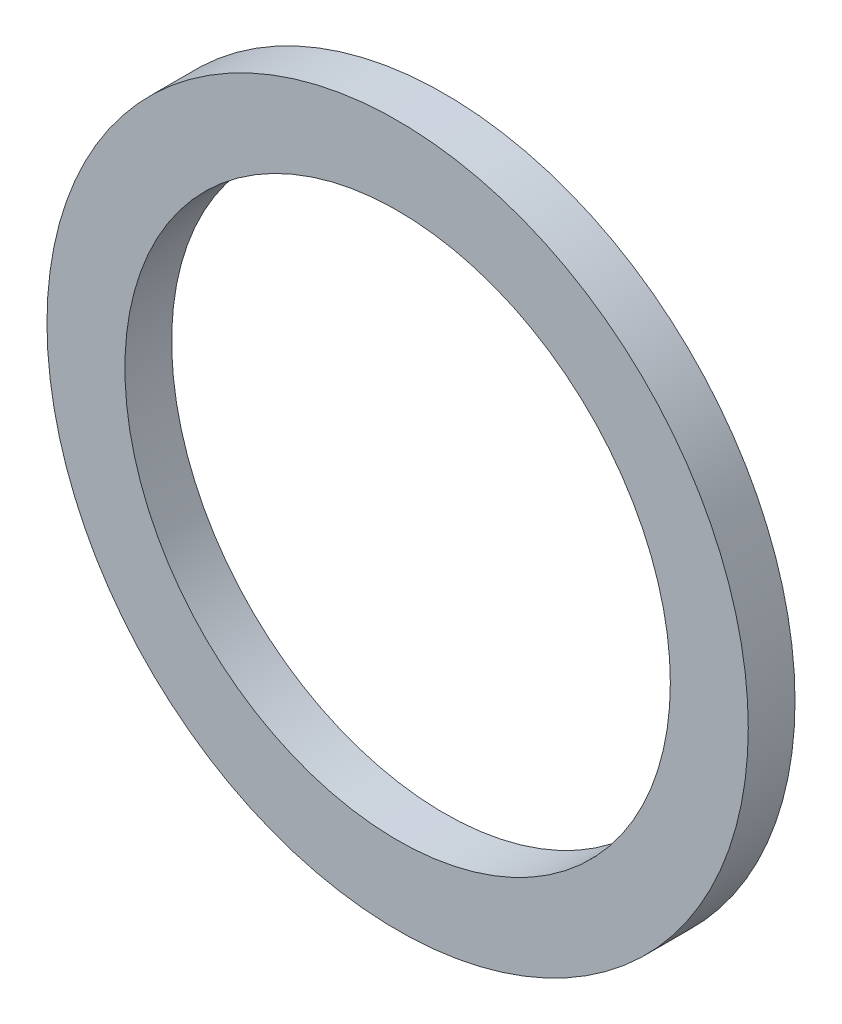
ISO-10303-21;
HEADER;
FILE_DESCRIPTION(('STEP AP214'),'2;1');
FILE_NAME('part.step','',(''),(''),'','','');
FILE_SCHEMA(('AUTOMOTIVE_DESIGN { 1 0 10303 214 1 1 1 1 }'));
ENDSEC;
DATA;
#1=APPLICATION_CONTEXT('core data for automotive mechanical design processes');
#2=APPLICATION_PROTOCOL_DEFINITION('international standard','automotive_design',2000,#1);
#3=PRODUCT_CONTEXT('',#1,'mechanical');
#4=PRODUCT('Part','Part','',(#3));
#5=PRODUCT_RELATED_PRODUCT_CATEGORY('part','',(#4));
#6=PRODUCT_DEFINITION_FORMATION('','',#4);
#7=PRODUCT_DEFINITION_CONTEXT('part definition',#1,'design');
#8=PRODUCT_DEFINITION('design','',#6,#7);
#9=PRODUCT_DEFINITION_SHAPE('','',#8);
#10=(LENGTH_UNIT() NAMED_UNIT(*) SI_UNIT(.MILLI.,.METRE.));
#11=(NAMED_UNIT(*) PLANE_ANGLE_UNIT() SI_UNIT($,.RADIAN.));
#12=(NAMED_UNIT(*) SI_UNIT($,.STERADIAN.) SOLID_ANGLE_UNIT());
#13=UNCERTAINTY_MEASURE_WITH_UNIT(LENGTH_MEASURE(1.E-05),#10,'distance_accuracy_value','');
#14=(GEOMETRIC_REPRESENTATION_CONTEXT(3) GLOBAL_UNCERTAINTY_ASSIGNED_CONTEXT((#13)) GLOBAL_UNIT_ASSIGNED_CONTEXT((#10,
#11,#12)) REPRESENTATION_CONTEXT('',''));
#15=CARTESIAN_POINT('',(0.,0.,0.));
#16=DIRECTION('',(0.,0.,1.));
#17=DIRECTION('',(1.,0.,0.));
#18=AXIS2_PLACEMENT_3D('',#15,#16,#17);
#19=CARTESIAN_POINT('',(0.,0.,2.));
#20=DIRECTION('',(0.,0.,1.));
#21=DIRECTION('',(1.,0.,0.));
#22=AXIS2_PLACEMENT_3D('',#19,#20,#21);
#23=PLANE('',#22);
#24=CARTESIAN_POINT('',(0.,0.,2.));
#25=DIRECTION('',(0.,0.,1.));
#26=DIRECTION('',(1.,0.,0.));
#27=AXIS2_PLACEMENT_3D('',#24,#25,#26);
#28=CIRCLE('',#27,22.5);
#29=CARTESIAN_POINT('',(22.5,0.,2.));
#30=VERTEX_POINT('',#29);
#31=EDGE_CURVE('E10',#30,#30,#28,.T.);
#32=ORIENTED_EDGE('',*,*,#31,.T.);
#33=EDGE_LOOP('',(#32));
#34=FACE_BOUND('',#33,.T.);
#35=CARTESIAN_POINT('',(0.,0.,2.));
#36=DIRECTION('',(0.,0.,1.));
#37=DIRECTION('',(1.,0.,0.));
#38=AXIS2_PLACEMENT_3D('',#35,#36,#37);
#39=CIRCLE('',#38,17.5);
#40=CARTESIAN_POINT('',(17.5,0.,2.));
#41=VERTEX_POINT('',#40);
#42=EDGE_CURVE('E46',#41,#41,#39,.T.);
#43=ORIENTED_EDGE('',*,*,#42,.F.);
#44=EDGE_LOOP('',(#43));
#45=FACE_BOUND('',#44,.T.);
#46=ADVANCED_FACE('F39',(#34,#45),#23,.T.);
#47=CARTESIAN_POINT('',(0.,0.,2.));
#48=DIRECTION('',(0.,0.,-1.));
#49=DIRECTION('',(-1.,0.,0.));
#50=AXIS2_PLACEMENT_3D('',#47,#48,#49);
#51=CYLINDRICAL_SURFACE('',#50,22.5);
#52=ORIENTED_EDGE('',*,*,#31,.F.);
#53=EDGE_LOOP('',(#52));
#54=FACE_BOUND('',#53,.T.);
#55=CARTESIAN_POINT('',(0.,0.,-1.));
#56=DIRECTION('',(0.,0.,-1.));
#57=DIRECTION('',(-1.,0.,0.));
#58=AXIS2_PLACEMENT_3D('',#55,#56,#57);
#59=CIRCLE('',#58,22.5);
#60=CARTESIAN_POINT('',(-22.5,0.,-1.));
#61=VERTEX_POINT('',#60);
#62=EDGE_CURVE('E50',#61,#61,#59,.T.);
#63=ORIENTED_EDGE('',*,*,#62,.F.);
#64=EDGE_LOOP('',(#63));
#65=FACE_BOUND('',#64,.T.);
#66=ADVANCED_FACE('F41',(#54,#65),#51,.T.);
#67=CARTESIAN_POINT('',(0.,0.,2.));
#68=DIRECTION('',(0.,0.,-1.));
#69=DIRECTION('',(-1.,0.,0.));
#70=AXIS2_PLACEMENT_3D('',#67,#68,#69);
#71=CYLINDRICAL_SURFACE('',#70,17.5);
#72=ORIENTED_EDGE('',*,*,#42,.T.);
#73=EDGE_LOOP('',(#72));
#74=FACE_BOUND('',#73,.T.);
#75=CARTESIAN_POINT('',(0.,0.,-1.));
#76=DIRECTION('',(0.,0.,1.));
#77=DIRECTION('',(1.,0.,0.));
#78=AXIS2_PLACEMENT_3D('',#75,#76,#77);
#79=CIRCLE('',#78,17.5);
#80=CARTESIAN_POINT('',(17.5,0.,-1.));
#81=VERTEX_POINT('',#80);
#82=EDGE_CURVE('E54',#81,#81,#79,.T.);
#83=ORIENTED_EDGE('',*,*,#82,.F.);
#84=EDGE_LOOP('',(#83));
#85=FACE_BOUND('',#84,.T.);
#86=ADVANCED_FACE('F63',(#74,#85),#71,.F.);
#87=CARTESIAN_POINT('',(0.,0.,-1.));
#88=DIRECTION('',(0.,0.,-1.));
#89=DIRECTION('',(-1.,0.,0.));
#90=AXIS2_PLACEMENT_3D('',#87,#88,#89);
#91=PLANE('',#90);
#92=ORIENTED_EDGE('',*,*,#82,.T.);
#93=EDGE_LOOP('',(#92));
#94=FACE_BOUND('',#93,.T.);
#95=ORIENTED_EDGE('',*,*,#62,.T.);
#96=EDGE_LOOP('',(#95));
#97=FACE_BOUND('',#96,.T.);
#98=ADVANCED_FACE('F60',(#94,#97),#91,.T.);
#99=CLOSED_SHELL('',(#46,#66,#86,#98));
#100=MANIFOLD_SOLID_BREP('B2',#99);
#101=ADVANCED_BREP_SHAPE_REPRESENTATION('',(#18,#100),#14);
#102=SHAPE_DEFINITION_REPRESENTATION(#9,#101);
ENDSEC;
END-ISO-10303-21;
